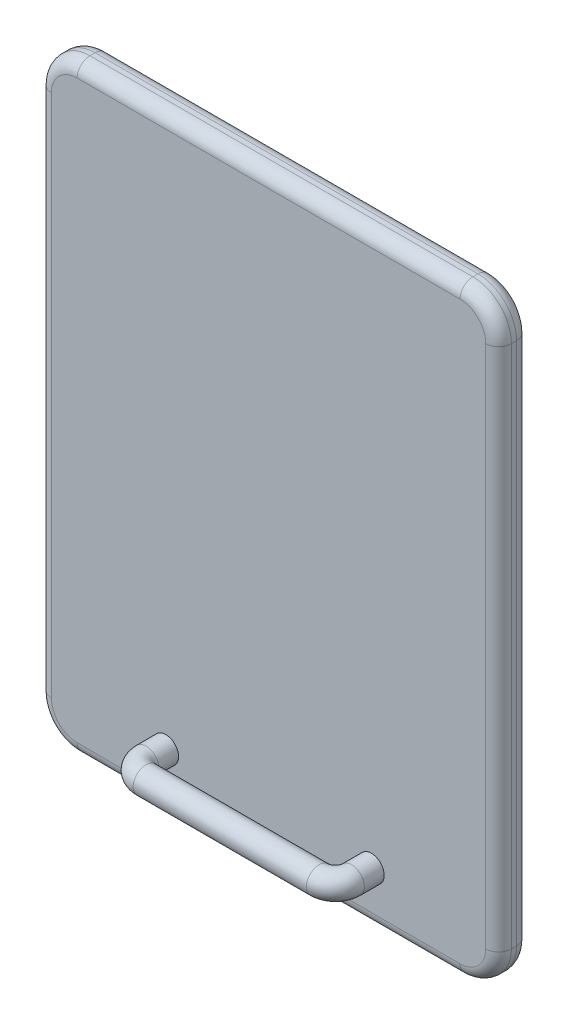
ISO-10303-21;
HEADER;
FILE_DESCRIPTION(('STEP AP214'),'2;1');
FILE_NAME('part.step','',(''),(''),'','','');
FILE_SCHEMA(('AUTOMOTIVE_DESIGN { 1 0 10303 214 1 1 1 1 }'));
ENDSEC;
DATA;
#1=APPLICATION_CONTEXT('core data for automotive mechanical design processes');
#2=APPLICATION_PROTOCOL_DEFINITION('international standard','automotive_design',2000,#1);
#3=PRODUCT_CONTEXT('',#1,'mechanical');
#4=PRODUCT('Part','Part','',(#3));
#5=PRODUCT_RELATED_PRODUCT_CATEGORY('part','',(#4));
#6=PRODUCT_DEFINITION_FORMATION('','',#4);
#7=PRODUCT_DEFINITION_CONTEXT('part definition',#1,'design');
#8=PRODUCT_DEFINITION('design','',#6,#7);
#9=PRODUCT_DEFINITION_SHAPE('','',#8);
#10=(LENGTH_UNIT() NAMED_UNIT(*) SI_UNIT(.MILLI.,.METRE.));
#11=(NAMED_UNIT(*) PLANE_ANGLE_UNIT() SI_UNIT($,.RADIAN.));
#12=(NAMED_UNIT(*) SI_UNIT($,.STERADIAN.) SOLID_ANGLE_UNIT());
#13=UNCERTAINTY_MEASURE_WITH_UNIT(LENGTH_MEASURE(1.E-05),#10,'distance_accuracy_value','');
#14=(GEOMETRIC_REPRESENTATION_CONTEXT(3) GLOBAL_UNCERTAINTY_ASSIGNED_CONTEXT((#13)) GLOBAL_UNIT_ASSIGNED_CONTEXT((#10,
#11,#12)) REPRESENTATION_CONTEXT('',''));
#15=CARTESIAN_POINT('',(0.,0.,0.));
#16=DIRECTION('',(0.,0.,1.));
#17=DIRECTION('',(1.,0.,0.));
#18=AXIS2_PLACEMENT_3D('',#15,#16,#17);
#19=CARTESIAN_POINT('',(717.5,-97.,554.));
#20=DIRECTION('',(0.,0.,1.));
#21=DIRECTION('',(1.,0.,0.));
#22=AXIS2_PLACEMENT_3D('',#19,#20,#21);
#23=CYLINDRICAL_SURFACE('',#22,5.);
#24=CARTESIAN_POINT('',(717.5,-97.,555.));
#25=DIRECTION('',(0.,0.,1.));
#26=DIRECTION('',(1.,0.,0.));
#27=AXIS2_PLACEMENT_3D('',#24,#25,#26);
#28=CIRCLE('',#27,5.);
#29=CARTESIAN_POINT('',(722.5,-97.,555.));
#30=VERTEX_POINT('',#29);
#31=EDGE_CURVE('E298',#30,#30,#28,.T.);
#32=ORIENTED_EDGE('',*,*,#31,.T.);
#33=EDGE_LOOP('',(#32));
#34=FACE_BOUND('',#33,.T.);
#35=CARTESIAN_POINT('',(717.5,-97.,562.7));
#36=DIRECTION('',(0.,0.,-1.));
#37=DIRECTION('',(-1.,0.,0.));
#38=AXIS2_PLACEMENT_3D('',#35,#36,#37);
#39=CIRCLE('',#38,5.);
#40=CARTESIAN_POINT('',(712.5,-97.,562.7));
#41=VERTEX_POINT('',#40);
#42=EDGE_CURVE('E56',#41,#41,#39,.T.);
#43=ORIENTED_EDGE('',*,*,#42,.T.);
#44=EDGE_LOOP('',(#43));
#45=FACE_BOUND('',#44,.T.);
#46=ADVANCED_FACE('F54',(#34,#45),#23,.T.);
#47=CARTESIAN_POINT('',(723.8,-97.,562.7));
#48=DIRECTION('',(0.,1.,0.));
#49=DIRECTION('',(0.,0.,1.));
#50=AXIS2_PLACEMENT_3D('',#47,#48,#49);
#51=TOROIDAL_SURFACE('',#50,6.29999999999986,5.);
#52=CARTESIAN_POINT('',(723.8,-97.,569.));
#53=DIRECTION('',(-1.,0.,0.));
#54=DIRECTION('',(0.,0.,1.));
#55=AXIS2_PLACEMENT_3D('',#52,#53,#54);
#56=CIRCLE('',#55,5.);
#57=CARTESIAN_POINT('',(723.8,-97.,574.));
#58=VERTEX_POINT('',#57);
#59=EDGE_CURVE('E302',#58,#58,#56,.T.);
#60=CARTESIAN_POINT('',(723.8,-97.,562.7));
#61=DIRECTION('',(0.,1.,0.));
#62=DIRECTION('',(0.,0.,1.));
#63=AXIS2_PLACEMENT_3D('',#60,#61,#62);
#64=CIRCLE('',#63,11.2999999999999);
#65=EDGE_CURVE('',#41,#58,#64,.T.);
#66=ORIENTED_EDGE('',*,*,#42,.F.);
#67=ORIENTED_EDGE('',*,*,#59,.T.);
#68=ORIENTED_EDGE('',*,*,#65,.T.);
#69=ORIENTED_EDGE('',*,*,#65,.F.);
#70=EDGE_LOOP('',(#66,#68,#67,#69));
#71=FACE_BOUND('',#70,.T.);
#72=ADVANCED_FACE('F313',(#71),#51,.T.);
#73=CARTESIAN_POINT('',(723.8,-97.,569.));
#74=DIRECTION('',(1.,0.,0.));
#75=DIRECTION('',(0.,0.,-1.));
#76=AXIS2_PLACEMENT_3D('',#73,#74,#75);
#77=CYLINDRICAL_SURFACE('',#76,5.);
#78=CARTESIAN_POINT('',(791.2,-97.,569.));
#79=DIRECTION('',(-1.,0.,0.));
#80=DIRECTION('',(0.,0.,1.));
#81=AXIS2_PLACEMENT_3D('',#78,#79,#80);
#82=CIRCLE('',#81,5.);
#83=CARTESIAN_POINT('',(791.2,-97.,574.));
#84=VERTEX_POINT('',#83);
#85=EDGE_CURVE('E63',#84,#84,#82,.T.);
#86=ORIENTED_EDGE('',*,*,#85,.T.);
#87=EDGE_LOOP('',(#86));
#88=FACE_BOUND('',#87,.T.);
#89=ORIENTED_EDGE('',*,*,#59,.F.);
#90=EDGE_LOOP('',(#89));
#91=FACE_BOUND('',#90,.T.);
#92=ADVANCED_FACE('F311',(#88,#91),#77,.T.);
#93=CARTESIAN_POINT('',(791.2,-97.,562.7));
#94=DIRECTION('',(0.,1.,0.));
#95=DIRECTION('',(0.,0.,1.));
#96=AXIS2_PLACEMENT_3D('',#93,#94,#95);
#97=TOROIDAL_SURFACE('',#96,6.29999999999986,5.);
#98=CARTESIAN_POINT('',(797.49999999999,-97.,562.700000000014));
#99=DIRECTION('',(0.,0.,1.));
#100=DIRECTION('',(1.,0.,0.));
#101=AXIS2_PLACEMENT_3D('',#98,#99,#100);
#102=CIRCLE('',#101,5.);
#103=CARTESIAN_POINT('',(802.5,-97.,562.700000000025));
#104=VERTEX_POINT('',#103);
#105=EDGE_CURVE('E12',#104,#104,#102,.T.);
#106=CARTESIAN_POINT('',(791.2,-97.,562.7));
#107=DIRECTION('',(0.,1.,0.));
#108=DIRECTION('',(0.,0.,1.));
#109=AXIS2_PLACEMENT_3D('',#106,#107,#108);
#110=CIRCLE('',#109,11.2999999999999);
#111=EDGE_CURVE('',#84,#104,#110,.T.);
#112=ORIENTED_EDGE('',*,*,#85,.F.);
#113=ORIENTED_EDGE('',*,*,#105,.T.);
#114=ORIENTED_EDGE('',*,*,#111,.T.);
#115=ORIENTED_EDGE('',*,*,#111,.F.);
#116=EDGE_LOOP('',(#112,#114,#113,#115));
#117=FACE_BOUND('',#116,.T.);
#118=ADVANCED_FACE('F318',(#117),#97,.T.);
#119=CARTESIAN_POINT('',(797.5,-97.,562.7));
#120=DIRECTION('',(0.,0.,-1.));
#121=DIRECTION('',(-1.,0.,0.));
#122=AXIS2_PLACEMENT_3D('',#119,#120,#121);
#123=CYLINDRICAL_SURFACE('',#122,5.);
#124=CARTESIAN_POINT('',(797.5,-97.,555.));
#125=DIRECTION('',(0.,0.,1.));
#126=DIRECTION('',(1.,0.,0.));
#127=AXIS2_PLACEMENT_3D('',#124,#125,#126);
#128=CIRCLE('',#127,5.);
#129=CARTESIAN_POINT('',(802.5,-97.,555.));
#130=VERTEX_POINT('',#129);
#131=EDGE_CURVE('E260',#130,#130,#128,.T.);
#132=ORIENTED_EDGE('',*,*,#131,.T.);
#133=EDGE_LOOP('',(#132));
#134=FACE_BOUND('',#133,.T.);
#135=ORIENTED_EDGE('',*,*,#105,.F.);
#136=EDGE_LOOP('',(#135));
#137=FACE_BOUND('',#136,.T.);
#138=ADVANCED_FACE('F60',(#134,#137),#123,.T.);
#139=CARTESIAN_POINT('',(683.,-102.,555.));
#140=DIRECTION('',(0.,0.,-1.));
#141=DIRECTION('',(-1.,0.,0.));
#142=AXIS2_PLACEMENT_3D('',#139,#140,#141);
#143=CYLINDRICAL_SURFACE('',#142,14.9999999999999);
#144=DIRECTION('',(0.,0.,-1.));
#145=VECTOR('',#144,1.);
#146=CARTESIAN_POINT('',(683.,-117.,555.));
#147=LINE('',#146,#145);
#148=CARTESIAN_POINT('',(683.,-117.,550.));
#149=VERTEX_POINT('',#148);
#150=CARTESIAN_POINT('',(683.,-117.,548.));
#151=VERTEX_POINT('',#150);
#152=EDGE_CURVE('E192',#149,#151,#147,.T.);
#153=ORIENTED_EDGE('',*,*,#152,.F.);
#154=CARTESIAN_POINT('',(683.,-102.,550.));
#155=DIRECTION('',(0.,0.,1.));
#156=DIRECTION('',(1.,0.,0.));
#157=AXIS2_PLACEMENT_3D('',#154,#155,#156);
#158=CIRCLE('',#157,14.9999999999999);
#159=CARTESIAN_POINT('',(668.,-102.,550.));
#160=VERTEX_POINT('',#159);
#161=EDGE_CURVE('E178',#149,#160,#158,.F.);
#162=ORIENTED_EDGE('',*,*,#161,.T.);
#163=DIRECTION('',(0.,0.,-1.));
#164=VECTOR('',#163,1.);
#165=CARTESIAN_POINT('',(668.,-102.,555.));
#166=LINE('',#165,#164);
#167=CARTESIAN_POINT('',(668.,-102.,548.));
#168=VERTEX_POINT('',#167);
#169=EDGE_CURVE('E277',#160,#168,#166,.T.);
#170=ORIENTED_EDGE('',*,*,#169,.T.);
#171=CARTESIAN_POINT('',(683.,-102.,548.));
#172=DIRECTION('',(0.,0.,1.));
#173=DIRECTION('',(1.,0.,0.));
#174=AXIS2_PLACEMENT_3D('',#171,#172,#173);
#175=CIRCLE('',#174,14.9999999999999);
#176=EDGE_CURVE('E211',#168,#151,#175,.T.);
#177=ORIENTED_EDGE('',*,*,#176,.T.);
#178=EDGE_LOOP('',(#153,#162,#170,#177));
#179=FACE_BOUND('',#178,.T.);
#180=ADVANCED_FACE('F323',(#179),#143,.T.);
#181=CARTESIAN_POINT('',(683.,-117.,555.));
#182=DIRECTION('',(0.,1.,0.));
#183=DIRECTION('',(0.,0.,1.));
#184=AXIS2_PLACEMENT_3D('',#181,#182,#183);
#185=PLANE('',#184);
#186=ORIENTED_EDGE('',*,*,#152,.T.);
#187=DIRECTION('',(1.,0.,0.));
#188=VECTOR('',#187,1.);
#189=CARTESIAN_POINT('',(683.,-117.,548.));
#190=LINE('',#189,#188);
#191=CARTESIAN_POINT('',(832.,-117.,548.));
#192=VERTEX_POINT('',#191);
#193=EDGE_CURVE('E243',#151,#192,#190,.T.);
#194=ORIENTED_EDGE('',*,*,#193,.T.);
#195=DIRECTION('',(0.,0.,-1.));
#196=VECTOR('',#195,1.);
#197=CARTESIAN_POINT('',(832.,-117.,555.));
#198=LINE('',#197,#196);
#199=CARTESIAN_POINT('',(832.,-117.,550.));
#200=VERTEX_POINT('',#199);
#201=EDGE_CURVE('E456',#200,#192,#198,.T.);
#202=ORIENTED_EDGE('',*,*,#201,.F.);
#203=DIRECTION('',(1.,0.,0.));
#204=VECTOR('',#203,1.);
#205=CARTESIAN_POINT('',(683.,-117.,550.));
#206=LINE('',#205,#204);
#207=EDGE_CURVE('E245',#200,#149,#206,.F.);
#208=ORIENTED_EDGE('',*,*,#207,.T.);
#209=EDGE_LOOP('',(#186,#194,#202,#208));
#210=FACE_BOUND('',#209,.T.);
#211=ADVANCED_FACE('F329',(#210),#185,.F.);
#212=CARTESIAN_POINT('',(832.,-102.,555.));
#213=DIRECTION('',(0.,0.,-1.));
#214=DIRECTION('',(-1.,0.,0.));
#215=AXIS2_PLACEMENT_3D('',#212,#213,#214);
#216=CYLINDRICAL_SURFACE('',#215,15.);
#217=DIRECTION('',(0.,0.,-1.));
#218=VECTOR('',#217,1.);
#219=CARTESIAN_POINT('',(847.,-102.,555.));
#220=LINE('',#219,#218);
#221=CARTESIAN_POINT('',(847.,-102.,550.));
#222=VERTEX_POINT('',#221);
#223=CARTESIAN_POINT('',(847.,-102.,548.));
#224=VERTEX_POINT('',#223);
#225=EDGE_CURVE('E454',#222,#224,#220,.T.);
#226=ORIENTED_EDGE('',*,*,#225,.F.);
#227=CARTESIAN_POINT('',(832.,-102.,550.));
#228=DIRECTION('',(0.,0.,1.));
#229=DIRECTION('',(1.,0.,0.));
#230=AXIS2_PLACEMENT_3D('',#227,#228,#229);
#231=CIRCLE('',#230,15.);
#232=EDGE_CURVE('E223',#222,#200,#231,.F.);
#233=ORIENTED_EDGE('',*,*,#232,.T.);
#234=ORIENTED_EDGE('',*,*,#201,.T.);
#235=CARTESIAN_POINT('',(832.,-102.,548.));
#236=DIRECTION('',(0.,0.,1.));
#237=DIRECTION('',(1.,0.,0.));
#238=AXIS2_PLACEMENT_3D('',#235,#236,#237);
#239=CIRCLE('',#238,15.);
#240=EDGE_CURVE('E224',#192,#224,#239,.T.);
#241=ORIENTED_EDGE('',*,*,#240,.T.);
#242=EDGE_LOOP('',(#226,#233,#234,#241));
#243=FACE_BOUND('',#242,.T.);
#244=ADVANCED_FACE('F371',(#243),#216,.T.);
#245=CARTESIAN_POINT('',(847.,-102.,555.));
#246=DIRECTION('',(-1.,0.,0.));
#247=DIRECTION('',(0.,0.,1.));
#248=AXIS2_PLACEMENT_3D('',#245,#246,#247);
#249=PLANE('',#248);
#250=DIRECTION('',(0.,0.,-1.));
#251=VECTOR('',#250,1.);
#252=CARTESIAN_POINT('',(847.,102.,555.));
#253=LINE('',#252,#251);
#254=CARTESIAN_POINT('',(847.,102.,550.));
#255=VERTEX_POINT('',#254);
#256=CARTESIAN_POINT('',(847.,102.,548.));
#257=VERTEX_POINT('',#256);
#258=EDGE_CURVE('E465',#255,#257,#253,.T.);
#259=ORIENTED_EDGE('',*,*,#258,.F.);
#260=DIRECTION('',(0.,1.,0.));
#261=VECTOR('',#260,1.);
#262=CARTESIAN_POINT('',(847.,-102.,550.));
#263=LINE('',#262,#261);
#264=EDGE_CURVE('E252',#255,#222,#263,.F.);
#265=ORIENTED_EDGE('',*,*,#264,.T.);
#266=ORIENTED_EDGE('',*,*,#225,.T.);
#267=DIRECTION('',(0.,1.,0.));
#268=VECTOR('',#267,1.);
#269=CARTESIAN_POINT('',(847.,-102.,548.));
#270=LINE('',#269,#268);
#271=EDGE_CURVE('E249',#224,#257,#270,.T.);
#272=ORIENTED_EDGE('',*,*,#271,.T.);
#273=EDGE_LOOP('',(#259,#265,#266,#272));
#274=FACE_BOUND('',#273,.T.);
#275=ADVANCED_FACE('F370',(#274),#249,.F.);
#276=CARTESIAN_POINT('',(832.,102.,555.));
#277=DIRECTION('',(0.,0.,-1.));
#278=DIRECTION('',(-1.,0.,0.));
#279=AXIS2_PLACEMENT_3D('',#276,#277,#278);
#280=CYLINDRICAL_SURFACE('',#279,15.);
#281=DIRECTION('',(0.,0.,-1.));
#282=VECTOR('',#281,1.);
#283=CARTESIAN_POINT('',(832.,117.,555.));
#284=LINE('',#283,#282);
#285=CARTESIAN_POINT('',(832.,117.,550.));
#286=VERTEX_POINT('',#285);
#287=CARTESIAN_POINT('',(832.,117.,548.));
#288=VERTEX_POINT('',#287);
#289=EDGE_CURVE('E464',#286,#288,#284,.T.);
#290=ORIENTED_EDGE('',*,*,#289,.F.);
#291=CARTESIAN_POINT('',(832.,102.,550.));
#292=DIRECTION('',(0.,0.,1.));
#293=DIRECTION('',(1.,0.,0.));
#294=AXIS2_PLACEMENT_3D('',#291,#292,#293);
#295=CIRCLE('',#294,15.);
#296=EDGE_CURVE('E222',#286,#255,#295,.F.);
#297=ORIENTED_EDGE('',*,*,#296,.T.);
#298=ORIENTED_EDGE('',*,*,#258,.T.);
#299=CARTESIAN_POINT('',(832.,102.,548.));
#300=DIRECTION('',(0.,0.,1.));
#301=DIRECTION('',(1.,0.,0.));
#302=AXIS2_PLACEMENT_3D('',#299,#300,#301);
#303=CIRCLE('',#302,15.);
#304=EDGE_CURVE('E217',#257,#288,#303,.T.);
#305=ORIENTED_EDGE('',*,*,#304,.T.);
#306=EDGE_LOOP('',(#290,#297,#298,#305));
#307=FACE_BOUND('',#306,.T.);
#308=ADVANCED_FACE('F361',(#307),#280,.T.);
#309=CARTESIAN_POINT('',(832.,117.,555.));
#310=DIRECTION('',(0.,-1.,0.));
#311=DIRECTION('',(0.,0.,-1.));
#312=AXIS2_PLACEMENT_3D('',#309,#310,#311);
#313=PLANE('',#312);
#314=DIRECTION('',(0.,0.,-1.));
#315=VECTOR('',#314,1.);
#316=CARTESIAN_POINT('',(683.,117.,555.));
#317=LINE('',#316,#315);
#318=CARTESIAN_POINT('',(683.,117.,550.));
#319=VERTEX_POINT('',#318);
#320=CARTESIAN_POINT('',(683.,117.,548.));
#321=VERTEX_POINT('',#320);
#322=EDGE_CURVE('E478',#319,#321,#317,.T.);
#323=ORIENTED_EDGE('',*,*,#322,.F.);
#324=DIRECTION('',(-1.,0.,0.));
#325=VECTOR('',#324,1.);
#326=CARTESIAN_POINT('',(832.,117.,550.));
#327=LINE('',#326,#325);
#328=EDGE_CURVE('E258',#319,#286,#327,.F.);
#329=ORIENTED_EDGE('',*,*,#328,.T.);
#330=ORIENTED_EDGE('',*,*,#289,.T.);
#331=DIRECTION('',(-1.,0.,0.));
#332=VECTOR('',#331,1.);
#333=CARTESIAN_POINT('',(832.,117.,548.));
#334=LINE('',#333,#332);
#335=EDGE_CURVE('E255',#288,#321,#334,.T.);
#336=ORIENTED_EDGE('',*,*,#335,.T.);
#337=EDGE_LOOP('',(#323,#329,#330,#336));
#338=FACE_BOUND('',#337,.T.);
#339=ADVANCED_FACE('F358',(#338),#313,.F.);
#340=CARTESIAN_POINT('',(683.,102.,555.));
#341=DIRECTION('',(0.,0.,-1.));
#342=DIRECTION('',(-1.,0.,0.));
#343=AXIS2_PLACEMENT_3D('',#340,#341,#342);
#344=CYLINDRICAL_SURFACE('',#343,14.9999999999999);
#345=DIRECTION('',(0.,0.,-1.));
#346=VECTOR('',#345,1.);
#347=CARTESIAN_POINT('',(668.,102.,555.));
#348=LINE('',#347,#346);
#349=CARTESIAN_POINT('',(668.,102.,550.));
#350=VERTEX_POINT('',#349);
#351=CARTESIAN_POINT('',(668.,102.,548.));
#352=VERTEX_POINT('',#351);
#353=EDGE_CURVE('E471',#350,#352,#348,.T.);
#354=ORIENTED_EDGE('',*,*,#353,.F.);
#355=CARTESIAN_POINT('',(683.,102.,550.));
#356=DIRECTION('',(0.,0.,1.));
#357=DIRECTION('',(1.,0.,0.));
#358=AXIS2_PLACEMENT_3D('',#355,#356,#357);
#359=CIRCLE('',#358,14.9999999999999);
#360=EDGE_CURVE('E216',#350,#319,#359,.F.);
#361=ORIENTED_EDGE('',*,*,#360,.T.);
#362=ORIENTED_EDGE('',*,*,#322,.T.);
#363=CARTESIAN_POINT('',(683.,102.,548.));
#364=DIRECTION('',(0.,0.,1.));
#365=DIRECTION('',(1.,0.,0.));
#366=AXIS2_PLACEMENT_3D('',#363,#364,#365);
#367=CIRCLE('',#366,14.9999999999999);
#368=EDGE_CURVE('E212',#321,#352,#367,.T.);
#369=ORIENTED_EDGE('',*,*,#368,.T.);
#370=EDGE_LOOP('',(#354,#361,#362,#369));
#371=FACE_BOUND('',#370,.T.);
#372=ADVANCED_FACE('F355',(#371),#344,.T.);
#373=CARTESIAN_POINT('',(668.,102.,555.));
#374=DIRECTION('',(1.,0.,0.));
#375=DIRECTION('',(0.,0.,-1.));
#376=AXIS2_PLACEMENT_3D('',#373,#374,#375);
#377=PLANE('',#376);
#378=ORIENTED_EDGE('',*,*,#353,.T.);
#379=DIRECTION('',(0.,-1.,0.));
#380=VECTOR('',#379,1.);
#381=CARTESIAN_POINT('',(668.,102.,548.));
#382=LINE('',#381,#380);
#383=EDGE_CURVE('E247',#352,#168,#382,.T.);
#384=ORIENTED_EDGE('',*,*,#383,.T.);
#385=ORIENTED_EDGE('',*,*,#169,.F.);
#386=DIRECTION('',(0.,-1.,0.));
#387=VECTOR('',#386,1.);
#388=CARTESIAN_POINT('',(668.,102.,550.));
#389=LINE('',#388,#387);
#390=EDGE_CURVE('E246',#160,#350,#389,.F.);
#391=ORIENTED_EDGE('',*,*,#390,.T.);
#392=EDGE_LOOP('',(#378,#384,#385,#391));
#393=FACE_BOUND('',#392,.T.);
#394=ADVANCED_FACE('F343',(#393),#377,.F.);
#395=CARTESIAN_POINT('',(683.,-102.,555.));
#396=DIRECTION('',(0.,0.,1.));
#397=DIRECTION('',(1.,0.,0.));
#398=AXIS2_PLACEMENT_3D('',#395,#396,#397);
#399=PLANE('',#398);
#400=ORIENTED_EDGE('',*,*,#31,.F.);
#401=EDGE_LOOP('',(#400));
#402=FACE_BOUND('',#401,.T.);
#403=ORIENTED_EDGE('',*,*,#131,.F.);
#404=EDGE_LOOP('',(#403));
#405=FACE_BOUND('',#404,.T.);
#406=CARTESIAN_POINT('',(832.,102.,555.));
#407=DIRECTION('',(0.,0.,1.));
#408=DIRECTION('',(1.,0.,0.));
#409=AXIS2_PLACEMENT_3D('',#406,#407,#408);
#410=CIRCLE('',#409,9.99999999999999);
#411=CARTESIAN_POINT('',(842.,102.,555.));
#412=VERTEX_POINT('',#411);
#413=CARTESIAN_POINT('',(832.,112.,555.));
#414=VERTEX_POINT('',#413);
#415=EDGE_CURVE('E202',#412,#414,#410,.T.);
#416=ORIENTED_EDGE('',*,*,#415,.T.);
#417=DIRECTION('',(-1.,0.,0.));
#418=VECTOR('',#417,1.);
#419=CARTESIAN_POINT('',(683.,112.,555.));
#420=LINE('',#419,#418);
#421=CARTESIAN_POINT('',(683.,112.,555.));
#422=VERTEX_POINT('',#421);
#423=EDGE_CURVE('E207',#414,#422,#420,.T.);
#424=ORIENTED_EDGE('',*,*,#423,.T.);
#425=CARTESIAN_POINT('',(683.,102.,555.));
#426=DIRECTION('',(0.,0.,1.));
#427=DIRECTION('',(1.,0.,0.));
#428=AXIS2_PLACEMENT_3D('',#425,#426,#427);
#429=CIRCLE('',#428,9.99999999999992);
#430=CARTESIAN_POINT('',(673.,102.,555.));
#431=VERTEX_POINT('',#430);
#432=EDGE_CURVE('E210',#422,#431,#429,.T.);
#433=ORIENTED_EDGE('',*,*,#432,.T.);
#434=DIRECTION('',(0.,-1.,0.));
#435=VECTOR('',#434,1.);
#436=CARTESIAN_POINT('',(673.,-102.,555.));
#437=LINE('',#436,#435);
#438=CARTESIAN_POINT('',(673.,-102.,555.));
#439=VERTEX_POINT('',#438);
#440=EDGE_CURVE('E197',#431,#439,#437,.T.);
#441=ORIENTED_EDGE('',*,*,#440,.T.);
#442=CARTESIAN_POINT('',(683.,-102.,555.));
#443=DIRECTION('',(0.,0.,1.));
#444=DIRECTION('',(1.,0.,0.));
#445=AXIS2_PLACEMENT_3D('',#442,#443,#444);
#446=CIRCLE('',#445,9.99999999999992);
#447=CARTESIAN_POINT('',(683.,-112.,555.));
#448=VERTEX_POINT('',#447);
#449=EDGE_CURVE('E180',#439,#448,#446,.T.);
#450=ORIENTED_EDGE('',*,*,#449,.T.);
#451=DIRECTION('',(1.,0.,0.));
#452=VECTOR('',#451,1.);
#453=CARTESIAN_POINT('',(832.,-112.,555.));
#454=LINE('',#453,#452);
#455=CARTESIAN_POINT('',(832.,-112.,555.));
#456=VERTEX_POINT('',#455);
#457=EDGE_CURVE('E186',#448,#456,#454,.T.);
#458=ORIENTED_EDGE('',*,*,#457,.T.);
#459=CARTESIAN_POINT('',(832.,-102.,555.));
#460=DIRECTION('',(0.,0.,1.));
#461=DIRECTION('',(1.,0.,0.));
#462=AXIS2_PLACEMENT_3D('',#459,#460,#461);
#463=CIRCLE('',#462,9.99999999999999);
#464=CARTESIAN_POINT('',(842.,-102.,555.));
#465=VERTEX_POINT('',#464);
#466=EDGE_CURVE('E195',#456,#465,#463,.T.);
#467=ORIENTED_EDGE('',*,*,#466,.T.);
#468=DIRECTION('',(0.,1.,0.));
#469=VECTOR('',#468,1.);
#470=CARTESIAN_POINT('',(842.,102.,555.));
#471=LINE('',#470,#469);
#472=EDGE_CURVE('E199',#465,#412,#471,.T.);
#473=ORIENTED_EDGE('',*,*,#472,.T.);
#474=EDGE_LOOP('',(#416,#424,#433,#441,#450,#458,#467,#473));
#475=FACE_BOUND('',#474,.T.);
#476=ADVANCED_FACE('F194',(#402,#405,#475),#399,.T.);
#477=CARTESIAN_POINT('',(683.,-102.,543.));
#478=DIRECTION('',(0.,0.,1.));
#479=DIRECTION('',(1.,0.,0.));
#480=AXIS2_PLACEMENT_3D('',#477,#478,#479);
#481=PLANE('',#480);
#482=CARTESIAN_POINT('',(832.,102.,543.));
#483=DIRECTION('',(0.,0.,1.));
#484=DIRECTION('',(1.,0.,0.));
#485=AXIS2_PLACEMENT_3D('',#482,#483,#484);
#486=CIRCLE('',#485,9.99999999999999);
#487=CARTESIAN_POINT('',(832.,112.,543.));
#488=VERTEX_POINT('',#487);
#489=CARTESIAN_POINT('',(842.,102.,543.));
#490=VERTEX_POINT('',#489);
#491=EDGE_CURVE('E239',#488,#490,#486,.F.);
#492=ORIENTED_EDGE('',*,*,#491,.T.);
#493=DIRECTION('',(0.,1.,0.));
#494=VECTOR('',#493,1.);
#495=CARTESIAN_POINT('',(842.,-102.,543.));
#496=LINE('',#495,#494);
#497=CARTESIAN_POINT('',(842.,-102.,543.));
#498=VERTEX_POINT('',#497);
#499=EDGE_CURVE('E78',#490,#498,#496,.F.);
#500=ORIENTED_EDGE('',*,*,#499,.T.);
#501=CARTESIAN_POINT('',(832.,-102.,543.));
#502=DIRECTION('',(0.,0.,1.));
#503=DIRECTION('',(1.,0.,0.));
#504=AXIS2_PLACEMENT_3D('',#501,#502,#503);
#505=CIRCLE('',#504,9.99999999999999);
#506=CARTESIAN_POINT('',(832.,-112.,543.));
#507=VERTEX_POINT('',#506);
#508=EDGE_CURVE('E240',#498,#507,#505,.F.);
#509=ORIENTED_EDGE('',*,*,#508,.T.);
#510=DIRECTION('',(1.,0.,0.));
#511=VECTOR('',#510,1.);
#512=CARTESIAN_POINT('',(683.,-112.,543.));
#513=LINE('',#512,#511);
#514=CARTESIAN_POINT('',(683.,-112.,543.));
#515=VERTEX_POINT('',#514);
#516=EDGE_CURVE('E234',#507,#515,#513,.F.);
#517=ORIENTED_EDGE('',*,*,#516,.T.);
#518=CARTESIAN_POINT('',(683.,-102.,543.));
#519=DIRECTION('',(0.,0.,1.));
#520=DIRECTION('',(1.,0.,0.));
#521=AXIS2_PLACEMENT_3D('',#518,#519,#520);
#522=CIRCLE('',#521,9.99999999999992);
#523=CARTESIAN_POINT('',(673.,-102.,543.));
#524=VERTEX_POINT('',#523);
#525=EDGE_CURVE('E232',#515,#524,#522,.F.);
#526=ORIENTED_EDGE('',*,*,#525,.T.);
#527=DIRECTION('',(0.,-1.,0.));
#528=VECTOR('',#527,1.);
#529=CARTESIAN_POINT('',(673.,-102.,543.));
#530=LINE('',#529,#528);
#531=CARTESIAN_POINT('',(673.,102.,543.));
#532=VERTEX_POINT('',#531);
#533=EDGE_CURVE('E231',#524,#532,#530,.F.);
#534=ORIENTED_EDGE('',*,*,#533,.T.);
#535=CARTESIAN_POINT('',(683.,102.,543.));
#536=DIRECTION('',(0.,0.,1.));
#537=DIRECTION('',(1.,0.,0.));
#538=AXIS2_PLACEMENT_3D('',#535,#536,#537);
#539=CIRCLE('',#538,9.99999999999992);
#540=CARTESIAN_POINT('',(683.,112.,543.));
#541=VERTEX_POINT('',#540);
#542=EDGE_CURVE('E228',#532,#541,#539,.F.);
#543=ORIENTED_EDGE('',*,*,#542,.T.);
#544=DIRECTION('',(-1.,0.,0.));
#545=VECTOR('',#544,1.);
#546=CARTESIAN_POINT('',(683.,112.,543.));
#547=LINE('',#546,#545);
#548=EDGE_CURVE('E230',#541,#488,#547,.F.);
#549=ORIENTED_EDGE('',*,*,#548,.T.);
#550=EDGE_LOOP('',(#492,#500,#509,#517,#526,#534,#543,#549));
#551=FACE_BOUND('',#550,.T.);
#552=ADVANCED_FACE('F342',(#551),#481,.F.);
#553=CARTESIAN_POINT('',(832.,102.,550.));
#554=DIRECTION('',(0.,0.,1.));
#555=DIRECTION('',(1.,0.,0.));
#556=AXIS2_PLACEMENT_3D('',#553,#554,#555);
#557=TOROIDAL_SURFACE('',#556,9.99999999999999,5.);
#558=CARTESIAN_POINT('',(842.,102.,550.));
#559=DIRECTION('',(0.,-1.,0.));
#560=DIRECTION('',(1.,0.,0.));
#561=AXIS2_PLACEMENT_3D('',#558,#559,#560);
#562=CIRCLE('',#561,5.);
#563=EDGE_CURVE('E269',#255,#412,#562,.T.);
#564=ORIENTED_EDGE('',*,*,#563,.F.);
#565=ORIENTED_EDGE('',*,*,#296,.F.);
#566=CARTESIAN_POINT('',(832.,112.,550.));
#567=DIRECTION('',(-1.,0.,0.));
#568=DIRECTION('',(0.,0.,1.));
#569=AXIS2_PLACEMENT_3D('',#566,#567,#568);
#570=CIRCLE('',#569,5.);
#571=EDGE_CURVE('E272',#414,#286,#570,.T.);
#572=ORIENTED_EDGE('',*,*,#571,.F.);
#573=ORIENTED_EDGE('',*,*,#415,.F.);
#574=EDGE_LOOP('',(#564,#565,#572,#573));
#575=FACE_BOUND('',#574,.T.);
#576=ADVANCED_FACE('F348',(#575),#557,.T.);
#577=CARTESIAN_POINT('',(683.,112.,550.));
#578=DIRECTION('',(1.,0.,0.));
#579=DIRECTION('',(0.,0.,-1.));
#580=AXIS2_PLACEMENT_3D('',#577,#578,#579);
#581=CYLINDRICAL_SURFACE('',#580,5.);
#582=ORIENTED_EDGE('',*,*,#571,.T.);
#583=ORIENTED_EDGE('',*,*,#328,.F.);
#584=CARTESIAN_POINT('',(683.,112.,550.));
#585=DIRECTION('',(-1.,0.,0.));
#586=DIRECTION('',(0.,0.,1.));
#587=AXIS2_PLACEMENT_3D('',#584,#585,#586);
#588=CIRCLE('',#587,5.);
#589=EDGE_CURVE('E270',#422,#319,#588,.T.);
#590=ORIENTED_EDGE('',*,*,#589,.F.);
#591=ORIENTED_EDGE('',*,*,#423,.F.);
#592=EDGE_LOOP('',(#582,#583,#590,#591));
#593=FACE_BOUND('',#592,.T.);
#594=ADVANCED_FACE('F398',(#593),#581,.T.);
#595=CARTESIAN_POINT('',(842.,-102.,550.));
#596=DIRECTION('',(0.,-1.,0.));
#597=DIRECTION('',(0.,0.,-1.));
#598=AXIS2_PLACEMENT_3D('',#595,#596,#597);
#599=CYLINDRICAL_SURFACE('',#598,5.);
#600=ORIENTED_EDGE('',*,*,#563,.T.);
#601=ORIENTED_EDGE('',*,*,#472,.F.);
#602=CARTESIAN_POINT('',(842.,-102.,550.));
#603=DIRECTION('',(0.,-1.,0.));
#604=DIRECTION('',(0.,0.,-1.));
#605=AXIS2_PLACEMENT_3D('',#602,#603,#604);
#606=CIRCLE('',#605,5.);
#607=EDGE_CURVE('E262',#222,#465,#606,.T.);
#608=ORIENTED_EDGE('',*,*,#607,.F.);
#609=ORIENTED_EDGE('',*,*,#264,.F.);
#610=EDGE_LOOP('',(#600,#601,#608,#609));
#611=FACE_BOUND('',#610,.T.);
#612=ADVANCED_FACE('F394',(#611),#599,.T.);
#613=CARTESIAN_POINT('',(683.,102.,550.));
#614=DIRECTION('',(0.,0.,1.));
#615=DIRECTION('',(1.,0.,0.));
#616=AXIS2_PLACEMENT_3D('',#613,#614,#615);
#617=TOROIDAL_SURFACE('',#616,9.99999999999992,5.);
#618=ORIENTED_EDGE('',*,*,#589,.T.);
#619=ORIENTED_EDGE('',*,*,#360,.F.);
#620=CARTESIAN_POINT('',(673.,102.,550.));
#621=DIRECTION('',(0.,-1.,0.));
#622=DIRECTION('',(1.,0.,0.));
#623=AXIS2_PLACEMENT_3D('',#620,#621,#622);
#624=CIRCLE('',#623,5.);
#625=EDGE_CURVE('E261',#431,#350,#624,.T.);
#626=ORIENTED_EDGE('',*,*,#625,.F.);
#627=ORIENTED_EDGE('',*,*,#432,.F.);
#628=EDGE_LOOP('',(#618,#619,#626,#627));
#629=FACE_BOUND('',#628,.T.);
#630=ADVANCED_FACE('F391',(#629),#617,.T.);
#631=CARTESIAN_POINT('',(832.,-102.,550.));
#632=DIRECTION('',(0.,0.,1.));
#633=DIRECTION('',(1.,0.,0.));
#634=AXIS2_PLACEMENT_3D('',#631,#632,#633);
#635=TOROIDAL_SURFACE('',#634,9.99999999999999,5.);
#636=ORIENTED_EDGE('',*,*,#607,.T.);
#637=ORIENTED_EDGE('',*,*,#466,.F.);
#638=CARTESIAN_POINT('',(832.,-112.,550.));
#639=DIRECTION('',(-1.,0.,0.));
#640=DIRECTION('',(0.,0.,1.));
#641=AXIS2_PLACEMENT_3D('',#638,#639,#640);
#642=CIRCLE('',#641,5.);
#643=EDGE_CURVE('E188',#200,#456,#642,.T.);
#644=ORIENTED_EDGE('',*,*,#643,.F.);
#645=ORIENTED_EDGE('',*,*,#232,.F.);
#646=EDGE_LOOP('',(#636,#637,#644,#645));
#647=FACE_BOUND('',#646,.T.);
#648=ADVANCED_FACE('F390',(#647),#635,.T.);
#649=CARTESIAN_POINT('',(673.,-102.,550.));
#650=DIRECTION('',(0.,1.,0.));
#651=DIRECTION('',(0.,0.,1.));
#652=AXIS2_PLACEMENT_3D('',#649,#650,#651);
#653=CYLINDRICAL_SURFACE('',#652,5.);
#654=ORIENTED_EDGE('',*,*,#625,.T.);
#655=ORIENTED_EDGE('',*,*,#390,.F.);
#656=CARTESIAN_POINT('',(673.,-102.,550.));
#657=DIRECTION('',(0.,-1.,0.));
#658=DIRECTION('',(1.,0.,0.));
#659=AXIS2_PLACEMENT_3D('',#656,#657,#658);
#660=CIRCLE('',#659,5.);
#661=EDGE_CURVE('E185',#439,#160,#660,.T.);
#662=ORIENTED_EDGE('',*,*,#661,.F.);
#663=ORIENTED_EDGE('',*,*,#440,.F.);
#664=EDGE_LOOP('',(#654,#655,#662,#663));
#665=FACE_BOUND('',#664,.T.);
#666=ADVANCED_FACE('F383',(#665),#653,.T.);
#667=CARTESIAN_POINT('',(683.,-112.,550.));
#668=DIRECTION('',(-1.,0.,0.));
#669=DIRECTION('',(0.,0.,1.));
#670=AXIS2_PLACEMENT_3D('',#667,#668,#669);
#671=CYLINDRICAL_SURFACE('',#670,5.);
#672=ORIENTED_EDGE('',*,*,#643,.T.);
#673=ORIENTED_EDGE('',*,*,#457,.F.);
#674=CARTESIAN_POINT('',(683.,-112.,550.));
#675=DIRECTION('',(-1.,0.,0.));
#676=DIRECTION('',(0.,0.,1.));
#677=AXIS2_PLACEMENT_3D('',#674,#675,#676);
#678=CIRCLE('',#677,5.);
#679=EDGE_CURVE('E172',#149,#448,#678,.T.);
#680=ORIENTED_EDGE('',*,*,#679,.F.);
#681=ORIENTED_EDGE('',*,*,#207,.F.);
#682=EDGE_LOOP('',(#672,#673,#680,#681));
#683=FACE_BOUND('',#682,.T.);
#684=ADVANCED_FACE('F190',(#683),#671,.T.);
#685=CARTESIAN_POINT('',(683.,-102.,550.));
#686=DIRECTION('',(0.,0.,1.));
#687=DIRECTION('',(1.,0.,0.));
#688=AXIS2_PLACEMENT_3D('',#685,#686,#687);
#689=TOROIDAL_SURFACE('',#688,9.99999999999992,5.);
#690=ORIENTED_EDGE('',*,*,#661,.T.);
#691=ORIENTED_EDGE('',*,*,#161,.F.);
#692=ORIENTED_EDGE('',*,*,#679,.T.);
#693=ORIENTED_EDGE('',*,*,#449,.F.);
#694=EDGE_LOOP('',(#690,#691,#692,#693));
#695=FACE_BOUND('',#694,.T.);
#696=ADVANCED_FACE('F174',(#695),#689,.T.);
#697=CARTESIAN_POINT('',(683.,-102.,548.));
#698=DIRECTION('',(0.,0.,1.));
#699=DIRECTION('',(1.,0.,0.));
#700=AXIS2_PLACEMENT_3D('',#697,#698,#699);
#701=TOROIDAL_SURFACE('',#700,9.99999999999992,5.);
#702=CARTESIAN_POINT('',(673.,-102.,548.));
#703=DIRECTION('',(0.,1.,0.));
#704=DIRECTION('',(-1.,0.,0.));
#705=AXIS2_PLACEMENT_3D('',#702,#703,#704);
#706=CIRCLE('',#705,5.);
#707=EDGE_CURVE('E295',#524,#168,#706,.T.);
#708=ORIENTED_EDGE('',*,*,#707,.F.);
#709=ORIENTED_EDGE('',*,*,#525,.F.);
#710=CARTESIAN_POINT('',(683.,-112.,548.));
#711=DIRECTION('',(1.,0.,0.));
#712=DIRECTION('',(0.,0.,-1.));
#713=AXIS2_PLACEMENT_3D('',#710,#711,#712);
#714=CIRCLE('',#713,5.);
#715=EDGE_CURVE('E181',#151,#515,#714,.T.);
#716=ORIENTED_EDGE('',*,*,#715,.F.);
#717=ORIENTED_EDGE('',*,*,#176,.F.);
#718=EDGE_LOOP('',(#708,#709,#716,#717));
#719=FACE_BOUND('',#718,.T.);
#720=ADVANCED_FACE('F381',(#719),#701,.T.);
#721=CARTESIAN_POINT('',(683.,-112.,548.));
#722=DIRECTION('',(1.,0.,0.));
#723=DIRECTION('',(0.,0.,-1.));
#724=AXIS2_PLACEMENT_3D('',#721,#722,#723);
#725=CYLINDRICAL_SURFACE('',#724,5.);
#726=ORIENTED_EDGE('',*,*,#715,.T.);
#727=ORIENTED_EDGE('',*,*,#516,.F.);
#728=CARTESIAN_POINT('',(832.,-112.,548.));
#729=DIRECTION('',(1.,0.,0.));
#730=DIRECTION('',(0.,0.,-1.));
#731=AXIS2_PLACEMENT_3D('',#728,#729,#730);
#732=CIRCLE('',#731,5.);
#733=EDGE_CURVE('E288',#192,#507,#732,.T.);
#734=ORIENTED_EDGE('',*,*,#733,.F.);
#735=ORIENTED_EDGE('',*,*,#193,.F.);
#736=EDGE_LOOP('',(#726,#727,#734,#735));
#737=FACE_BOUND('',#736,.T.);
#738=ADVANCED_FACE('F427',(#737),#725,.T.);
#739=CARTESIAN_POINT('',(673.,102.,548.));
#740=DIRECTION('',(0.,-1.,0.));
#741=DIRECTION('',(0.,0.,-1.));
#742=AXIS2_PLACEMENT_3D('',#739,#740,#741);
#743=CYLINDRICAL_SURFACE('',#742,5.);
#744=ORIENTED_EDGE('',*,*,#707,.T.);
#745=ORIENTED_EDGE('',*,*,#383,.F.);
#746=CARTESIAN_POINT('',(673.,102.,548.));
#747=DIRECTION('',(0.,1.,0.));
#748=DIRECTION('',(0.,0.,1.));
#749=AXIS2_PLACEMENT_3D('',#746,#747,#748);
#750=CIRCLE('',#749,5.);
#751=EDGE_CURVE('E286',#532,#352,#750,.T.);
#752=ORIENTED_EDGE('',*,*,#751,.F.);
#753=ORIENTED_EDGE('',*,*,#533,.F.);
#754=EDGE_LOOP('',(#744,#745,#752,#753));
#755=FACE_BOUND('',#754,.T.);
#756=ADVANCED_FACE('F422',(#755),#743,.T.);
#757=CARTESIAN_POINT('',(832.,-102.,548.));
#758=DIRECTION('',(0.,0.,1.));
#759=DIRECTION('',(1.,0.,0.));
#760=AXIS2_PLACEMENT_3D('',#757,#758,#759);
#761=TOROIDAL_SURFACE('',#760,9.99999999999999,5.);
#762=ORIENTED_EDGE('',*,*,#733,.T.);
#763=ORIENTED_EDGE('',*,*,#508,.F.);
#764=CARTESIAN_POINT('',(842.,-102.,548.));
#765=DIRECTION('',(0.,1.,0.));
#766=DIRECTION('',(0.,0.,1.));
#767=AXIS2_PLACEMENT_3D('',#764,#765,#766);
#768=CIRCLE('',#767,5.);
#769=EDGE_CURVE('E282',#224,#498,#768,.T.);
#770=ORIENTED_EDGE('',*,*,#769,.F.);
#771=ORIENTED_EDGE('',*,*,#240,.F.);
#772=EDGE_LOOP('',(#762,#763,#770,#771));
#773=FACE_BOUND('',#772,.T.);
#774=ADVANCED_FACE('F423',(#773),#761,.T.);
#775=CARTESIAN_POINT('',(683.,102.,548.));
#776=DIRECTION('',(0.,0.,1.));
#777=DIRECTION('',(1.,0.,0.));
#778=AXIS2_PLACEMENT_3D('',#775,#776,#777);
#779=TOROIDAL_SURFACE('',#778,9.99999999999992,5.);
#780=ORIENTED_EDGE('',*,*,#751,.T.);
#781=ORIENTED_EDGE('',*,*,#368,.F.);
#782=CARTESIAN_POINT('',(683.,112.,548.));
#783=DIRECTION('',(1.,0.,0.));
#784=DIRECTION('',(0.,0.,-1.));
#785=AXIS2_PLACEMENT_3D('',#782,#783,#784);
#786=CIRCLE('',#785,5.);
#787=EDGE_CURVE('E278',#541,#321,#786,.T.);
#788=ORIENTED_EDGE('',*,*,#787,.F.);
#789=ORIENTED_EDGE('',*,*,#542,.F.);
#790=EDGE_LOOP('',(#780,#781,#788,#789));
#791=FACE_BOUND('',#790,.T.);
#792=ADVANCED_FACE('F417',(#791),#779,.T.);
#793=CARTESIAN_POINT('',(842.,-102.,548.));
#794=DIRECTION('',(0.,1.,0.));
#795=DIRECTION('',(0.,0.,1.));
#796=AXIS2_PLACEMENT_3D('',#793,#794,#795);
#797=CYLINDRICAL_SURFACE('',#796,5.);
#798=ORIENTED_EDGE('',*,*,#769,.T.);
#799=ORIENTED_EDGE('',*,*,#499,.F.);
#800=CARTESIAN_POINT('',(842.,102.,548.));
#801=DIRECTION('',(0.,1.,0.));
#802=DIRECTION('',(0.,0.,1.));
#803=AXIS2_PLACEMENT_3D('',#800,#801,#802);
#804=CIRCLE('',#803,5.);
#805=EDGE_CURVE('E75',#257,#490,#804,.T.);
#806=ORIENTED_EDGE('',*,*,#805,.F.);
#807=ORIENTED_EDGE('',*,*,#271,.F.);
#808=EDGE_LOOP('',(#798,#799,#806,#807));
#809=FACE_BOUND('',#808,.T.);
#810=ADVANCED_FACE('F412',(#809),#797,.T.);
#811=CARTESIAN_POINT('',(832.,112.,548.));
#812=DIRECTION('',(-1.,0.,0.));
#813=DIRECTION('',(0.,0.,1.));
#814=AXIS2_PLACEMENT_3D('',#811,#812,#813);
#815=CYLINDRICAL_SURFACE('',#814,5.);
#816=ORIENTED_EDGE('',*,*,#787,.T.);
#817=ORIENTED_EDGE('',*,*,#335,.F.);
#818=CARTESIAN_POINT('',(832.,112.,548.));
#819=DIRECTION('',(1.,0.,0.));
#820=DIRECTION('',(0.,0.,-1.));
#821=AXIS2_PLACEMENT_3D('',#818,#819,#820);
#822=CIRCLE('',#821,5.);
#823=EDGE_CURVE('E280',#488,#288,#822,.T.);
#824=ORIENTED_EDGE('',*,*,#823,.F.);
#825=ORIENTED_EDGE('',*,*,#548,.F.);
#826=EDGE_LOOP('',(#816,#817,#824,#825));
#827=FACE_BOUND('',#826,.T.);
#828=ADVANCED_FACE('F409',(#827),#815,.T.);
#829=CARTESIAN_POINT('',(832.,102.,548.));
#830=DIRECTION('',(0.,0.,1.));
#831=DIRECTION('',(1.,0.,0.));
#832=AXIS2_PLACEMENT_3D('',#829,#830,#831);
#833=TOROIDAL_SURFACE('',#832,9.99999999999999,5.);
#834=ORIENTED_EDGE('',*,*,#805,.T.);
#835=ORIENTED_EDGE('',*,*,#491,.F.);
#836=ORIENTED_EDGE('',*,*,#823,.T.);
#837=ORIENTED_EDGE('',*,*,#304,.F.);
#838=EDGE_LOOP('',(#834,#835,#836,#837));
#839=FACE_BOUND('',#838,.T.);
#840=ADVANCED_FACE('F410',(#839),#833,.T.);
#841=CLOSED_SHELL('',(#46,#72,#92,#118,#138,#180,#211,#244,#275,#308,#339,#372,#394,#476,#552,
#576,#594,#612,#630,#648,#666,#684,#696,#720,#738,#756,#774,#792,#810,#828,#840));
#842=MANIFOLD_SOLID_BREP('B2',#841);
#843=ADVANCED_BREP_SHAPE_REPRESENTATION('',(#18,#842),#14);
#844=SHAPE_DEFINITION_REPRESENTATION(#9,#843);
ENDSEC;
END-ISO-10303-21;
